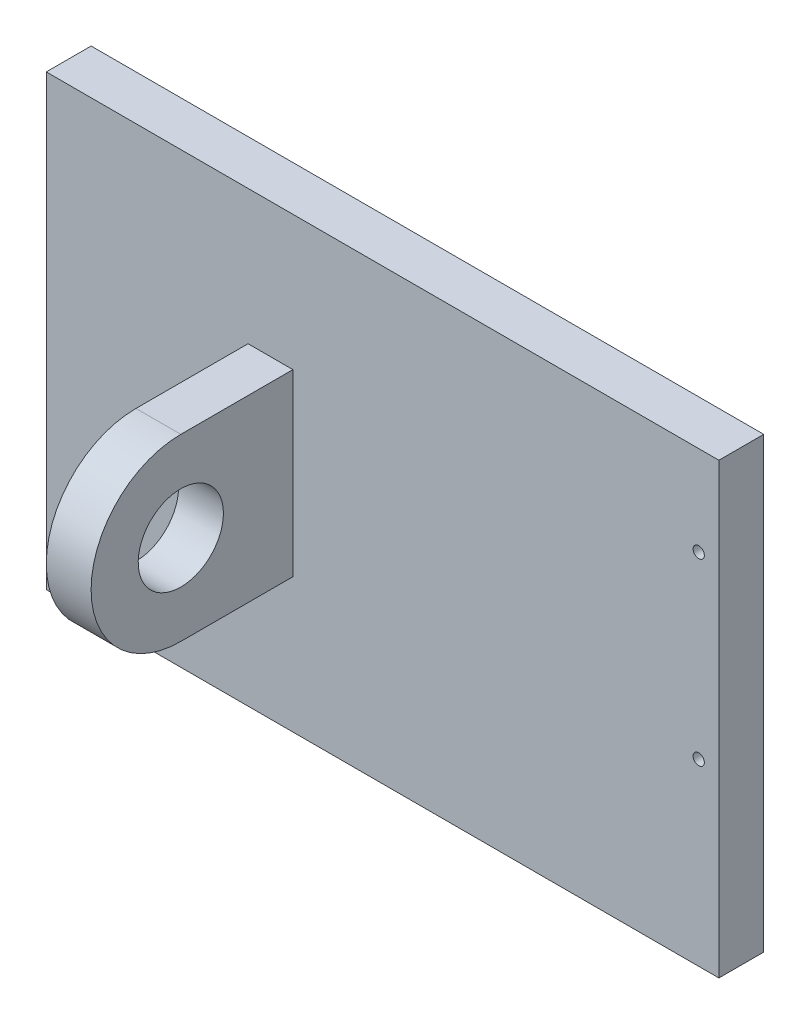
ISO-10303-21;
HEADER;
FILE_DESCRIPTION(('STEP AP214'),'2;1');
FILE_NAME('part.step','',(''),(''),'','','');
FILE_SCHEMA(('AUTOMOTIVE_DESIGN { 1 0 10303 214 1 1 1 1 }'));
ENDSEC;
DATA;
#1=APPLICATION_CONTEXT('core data for automotive mechanical design processes');
#2=APPLICATION_PROTOCOL_DEFINITION('international standard','automotive_design',2000,#1);
#3=PRODUCT_CONTEXT('',#1,'mechanical');
#4=PRODUCT('Part','Part','',(#3));
#5=PRODUCT_RELATED_PRODUCT_CATEGORY('part','',(#4));
#6=PRODUCT_DEFINITION_FORMATION('','',#4);
#7=PRODUCT_DEFINITION_CONTEXT('part definition',#1,'design');
#8=PRODUCT_DEFINITION('design','',#6,#7);
#9=PRODUCT_DEFINITION_SHAPE('','',#8);
#10=(LENGTH_UNIT() NAMED_UNIT(*) SI_UNIT(.MILLI.,.METRE.));
#11=(NAMED_UNIT(*) PLANE_ANGLE_UNIT() SI_UNIT($,.RADIAN.));
#12=(NAMED_UNIT(*) SI_UNIT($,.STERADIAN.) SOLID_ANGLE_UNIT());
#13=UNCERTAINTY_MEASURE_WITH_UNIT(LENGTH_MEASURE(1.E-05),#10,'distance_accuracy_value','');
#14=(GEOMETRIC_REPRESENTATION_CONTEXT(3) GLOBAL_UNCERTAINTY_ASSIGNED_CONTEXT((#13)) GLOBAL_UNIT_ASSIGNED_CONTEXT((#10,
#11,#12)) REPRESENTATION_CONTEXT('',''));
#15=CARTESIAN_POINT('',(0.,0.,0.));
#16=DIRECTION('',(0.,0.,1.));
#17=DIRECTION('',(1.,0.,0.));
#18=AXIS2_PLACEMENT_3D('',#15,#16,#17);
#19=CARTESIAN_POINT('',(0.,0.,10.));
#20=DIRECTION('',(0.,0.,1.));
#21=DIRECTION('',(1.,0.,0.));
#22=AXIS2_PLACEMENT_3D('',#19,#20,#21);
#23=PLANE('',#22);
#24=CARTESIAN_POINT('',(70.5,-10.00089870144,10.));
#25=DIRECTION('',(0.,0.,1.));
#26=DIRECTION('',(1.,0.,0.));
#27=AXIS2_PLACEMENT_3D('',#24,#25,#26);
#28=CIRCLE('',#27,1.24999999999999);
#29=CARTESIAN_POINT('',(71.75,-10.00089870144,10.));
#30=VERTEX_POINT('',#29);
#31=EDGE_CURVE('E242',#30,#30,#28,.T.);
#32=ORIENTED_EDGE('',*,*,#31,.F.);
#33=EDGE_LOOP('',(#32));
#34=FACE_BOUND('',#33,.T.);
#35=CARTESIAN_POINT('',(70.5,29.99910129856,10.));
#36=DIRECTION('',(0.,0.,1.));
#37=DIRECTION('',(1.,0.,0.));
#38=AXIS2_PLACEMENT_3D('',#35,#36,#37);
#39=CIRCLE('',#38,1.24999999999999);
#40=CARTESIAN_POINT('',(71.75,29.99910129856,10.));
#41=VERTEX_POINT('',#40);
#42=EDGE_CURVE('E244',#41,#41,#39,.T.);
#43=ORIENTED_EDGE('',*,*,#42,.F.);
#44=EDGE_LOOP('',(#43));
#45=FACE_BOUND('',#44,.T.);
#46=DIRECTION('',(0.,1.,0.));
#47=VECTOR('',#46,1.);
#48=CARTESIAN_POINT('',(75.,50.,10.));
#49=LINE('',#48,#47);
#50=CARTESIAN_POINT('',(75.,-50.,10.));
#51=VERTEX_POINT('',#50);
#52=CARTESIAN_POINT('',(75.,50.,10.));
#53=VERTEX_POINT('',#52);
#54=EDGE_CURVE('E161',#51,#53,#49,.T.);
#55=ORIENTED_EDGE('',*,*,#54,.T.);
#56=DIRECTION('',(-1.,0.,0.));
#57=VECTOR('',#56,1.);
#58=CARTESIAN_POINT('',(-75.,50.,10.));
#59=LINE('',#58,#57);
#60=CARTESIAN_POINT('',(-75.,50.,10.));
#61=VERTEX_POINT('',#60);
#62=EDGE_CURVE('E92',#53,#61,#59,.T.);
#63=ORIENTED_EDGE('',*,*,#62,.T.);
#64=DIRECTION('',(0.,-1.,0.));
#65=VECTOR('',#64,1.);
#66=CARTESIAN_POINT('',(-75.,50.,10.));
#67=LINE('',#66,#65);
#68=CARTESIAN_POINT('',(-75.,-50.,10.));
#69=VERTEX_POINT('',#68);
#70=EDGE_CURVE('E164',#61,#69,#67,.T.);
#71=ORIENTED_EDGE('',*,*,#70,.T.);
#72=DIRECTION('',(1.,0.,0.));
#73=VECTOR('',#72,1.);
#74=CARTESIAN_POINT('',(-75.,-50.,10.));
#75=LINE('',#74,#73);
#76=EDGE_CURVE('E64',#69,#51,#75,.T.);
#77=ORIENTED_EDGE('',*,*,#76,.T.);
#78=EDGE_LOOP('',(#55,#63,#71,#77));
#79=FACE_BOUND('',#78,.T.);
#80=DIRECTION('',(0.,1.,0.));
#81=VECTOR('',#80,1.);
#82=CARTESIAN_POINT('',(-30.,0.,10.));
#83=LINE('',#82,#81);
#84=CARTESIAN_POINT('',(-30.,-20.,10.));
#85=VERTEX_POINT('',#84);
#86=CARTESIAN_POINT('',(-30.,20.,10.));
#87=VERTEX_POINT('',#86);
#88=EDGE_CURVE('E131',#85,#87,#83,.T.);
#89=ORIENTED_EDGE('',*,*,#88,.T.);
#90=DIRECTION('',(1.,0.,0.));
#91=VECTOR('',#90,1.);
#92=CARTESIAN_POINT('',(0.,20.,10.));
#93=LINE('',#92,#91);
#94=CARTESIAN_POINT('',(-20.,20.,10.));
#95=VERTEX_POINT('',#94);
#96=EDGE_CURVE('E157',#87,#95,#93,.T.);
#97=ORIENTED_EDGE('',*,*,#96,.T.);
#98=DIRECTION('',(0.,-1.,0.));
#99=VECTOR('',#98,1.);
#100=CARTESIAN_POINT('',(-20.,0.,10.));
#101=LINE('',#100,#99);
#102=CARTESIAN_POINT('',(-20.,-20.,10.));
#103=VERTEX_POINT('',#102);
#104=EDGE_CURVE('E151',#95,#103,#101,.T.);
#105=ORIENTED_EDGE('',*,*,#104,.T.);
#106=DIRECTION('',(-1.,0.,0.));
#107=VECTOR('',#106,1.);
#108=CARTESIAN_POINT('',(0.,-20.,10.));
#109=LINE('',#108,#107);
#110=EDGE_CURVE('E154',#103,#85,#109,.T.);
#111=ORIENTED_EDGE('',*,*,#110,.T.);
#112=EDGE_LOOP('',(#89,#97,#105,#111));
#113=FACE_BOUND('',#112,.T.);
#114=ADVANCED_FACE('F40',(#34,#45,#79,#113),#23,.T.);
#115=CARTESIAN_POINT('',(75.,50.,10.));
#116=DIRECTION('',(-1.,0.,0.));
#117=DIRECTION('',(0.,-1.,0.));
#118=AXIS2_PLACEMENT_3D('',#115,#116,#117);
#119=PLANE('',#118);
#120=DIRECTION('',(0.,1.,0.));
#121=VECTOR('',#120,1.);
#122=CARTESIAN_POINT('',(75.,50.,0.));
#123=LINE('',#122,#121);
#124=CARTESIAN_POINT('',(75.,-50.,0.));
#125=VERTEX_POINT('',#124);
#126=CARTESIAN_POINT('',(75.,50.,0.));
#127=VERTEX_POINT('',#126);
#128=EDGE_CURVE('E160',#125,#127,#123,.T.);
#129=ORIENTED_EDGE('',*,*,#128,.T.);
#130=DIRECTION('',(0.,0.,-1.));
#131=VECTOR('',#130,1.);
#132=CARTESIAN_POINT('',(75.,50.,10.));
#133=LINE('',#132,#131);
#134=EDGE_CURVE('E11',#53,#127,#133,.T.);
#135=ORIENTED_EDGE('',*,*,#134,.F.);
#136=ORIENTED_EDGE('',*,*,#54,.F.);
#137=DIRECTION('',(0.,0.,-1.));
#138=VECTOR('',#137,1.);
#139=CARTESIAN_POINT('',(75.,-50.,10.));
#140=LINE('',#139,#138);
#141=EDGE_CURVE('E167',#51,#125,#140,.T.);
#142=ORIENTED_EDGE('',*,*,#141,.T.);
#143=EDGE_LOOP('',(#129,#135,#136,#142));
#144=FACE_BOUND('',#143,.T.);
#145=ADVANCED_FACE('F42',(#144),#119,.F.);
#146=CARTESIAN_POINT('',(-75.,50.,10.));
#147=DIRECTION('',(0.,-1.,0.));
#148=DIRECTION('',(0.,0.,-1.));
#149=AXIS2_PLACEMENT_3D('',#146,#147,#148);
#150=PLANE('',#149);
#151=DIRECTION('',(-1.,0.,0.));
#152=VECTOR('',#151,1.);
#153=CARTESIAN_POINT('',(-75.,50.,0.));
#154=LINE('',#153,#152);
#155=CARTESIAN_POINT('',(-75.,50.,0.));
#156=VERTEX_POINT('',#155);
#157=EDGE_CURVE('E170',#127,#156,#154,.T.);
#158=ORIENTED_EDGE('',*,*,#157,.T.);
#159=DIRECTION('',(0.,0.,-1.));
#160=VECTOR('',#159,1.);
#161=CARTESIAN_POINT('',(-75.,50.,10.));
#162=LINE('',#161,#160);
#163=EDGE_CURVE('E48',#61,#156,#162,.T.);
#164=ORIENTED_EDGE('',*,*,#163,.F.);
#165=ORIENTED_EDGE('',*,*,#62,.F.);
#166=ORIENTED_EDGE('',*,*,#134,.T.);
#167=EDGE_LOOP('',(#158,#164,#165,#166));
#168=FACE_BOUND('',#167,.T.);
#169=ADVANCED_FACE('F199',(#168),#150,.F.);
#170=CARTESIAN_POINT('',(-75.,50.,10.));
#171=DIRECTION('',(1.,0.,0.));
#172=DIRECTION('',(0.,1.,0.));
#173=AXIS2_PLACEMENT_3D('',#170,#171,#172);
#174=PLANE('',#173);
#175=DIRECTION('',(0.,-1.,0.));
#176=VECTOR('',#175,1.);
#177=CARTESIAN_POINT('',(-75.,50.,0.));
#178=LINE('',#177,#176);
#179=CARTESIAN_POINT('',(-75.,-50.,0.));
#180=VERTEX_POINT('',#179);
#181=EDGE_CURVE('E172',#156,#180,#178,.T.);
#182=ORIENTED_EDGE('',*,*,#181,.T.);
#183=DIRECTION('',(0.,0.,-1.));
#184=VECTOR('',#183,1.);
#185=CARTESIAN_POINT('',(-75.,-50.,10.));
#186=LINE('',#185,#184);
#187=EDGE_CURVE('E176',#69,#180,#186,.T.);
#188=ORIENTED_EDGE('',*,*,#187,.F.);
#189=ORIENTED_EDGE('',*,*,#70,.F.);
#190=ORIENTED_EDGE('',*,*,#163,.T.);
#191=EDGE_LOOP('',(#182,#188,#189,#190));
#192=FACE_BOUND('',#191,.T.);
#193=ADVANCED_FACE('F181',(#192),#174,.F.);
#194=CARTESIAN_POINT('',(-75.,-50.,10.));
#195=DIRECTION('',(0.,1.,0.));
#196=DIRECTION('',(0.,0.,1.));
#197=AXIS2_PLACEMENT_3D('',#194,#195,#196);
#198=PLANE('',#197);
#199=DIRECTION('',(1.,0.,0.));
#200=VECTOR('',#199,1.);
#201=CARTESIAN_POINT('',(-75.,-50.,0.));
#202=LINE('',#201,#200);
#203=EDGE_CURVE('E85',#180,#125,#202,.T.);
#204=ORIENTED_EDGE('',*,*,#203,.T.);
#205=ORIENTED_EDGE('',*,*,#141,.F.);
#206=ORIENTED_EDGE('',*,*,#76,.F.);
#207=ORIENTED_EDGE('',*,*,#187,.T.);
#208=EDGE_LOOP('',(#204,#205,#206,#207));
#209=FACE_BOUND('',#208,.T.);
#210=ADVANCED_FACE('F189',(#209),#198,.F.);
#211=CARTESIAN_POINT('',(0.,0.,0.));
#212=DIRECTION('',(0.,0.,1.));
#213=DIRECTION('',(1.,0.,0.));
#214=AXIS2_PLACEMENT_3D('',#211,#212,#213);
#215=PLANE('',#214);
#216=CARTESIAN_POINT('',(70.5,-10.00089870144,0.));
#217=DIRECTION('',(0.,0.,1.));
#218=DIRECTION('',(1.,0.,0.));
#219=AXIS2_PLACEMENT_3D('',#216,#217,#218);
#220=CIRCLE('',#219,1.24999999999999);
#221=CARTESIAN_POINT('',(71.75,-10.00089870144,0.));
#222=VERTEX_POINT('',#221);
#223=EDGE_CURVE('E240',#222,#222,#220,.T.);
#224=ORIENTED_EDGE('',*,*,#223,.T.);
#225=EDGE_LOOP('',(#224));
#226=FACE_BOUND('',#225,.T.);
#227=CARTESIAN_POINT('',(70.5,29.99910129856,0.));
#228=DIRECTION('',(0.,0.,1.));
#229=DIRECTION('',(1.,0.,0.));
#230=AXIS2_PLACEMENT_3D('',#227,#228,#229);
#231=CIRCLE('',#230,1.24999999999999);
#232=CARTESIAN_POINT('',(71.75,29.99910129856,0.));
#233=VERTEX_POINT('',#232);
#234=EDGE_CURVE('E249',#233,#233,#231,.T.);
#235=ORIENTED_EDGE('',*,*,#234,.T.);
#236=EDGE_LOOP('',(#235));
#237=FACE_BOUND('',#236,.T.);
#238=ORIENTED_EDGE('',*,*,#128,.F.);
#239=ORIENTED_EDGE('',*,*,#203,.F.);
#240=ORIENTED_EDGE('',*,*,#181,.F.);
#241=ORIENTED_EDGE('',*,*,#157,.F.);
#242=EDGE_LOOP('',(#238,#239,#240,#241));
#243=FACE_BOUND('',#242,.T.);
#244=ADVANCED_FACE('F185',(#226,#237,#243),#215,.F.);
#245=CARTESIAN_POINT('',(-20.,20.,35.));
#246=DIRECTION('',(0.,-1.,0.));
#247=DIRECTION('',(0.,0.,-1.));
#248=AXIS2_PLACEMENT_3D('',#245,#246,#247);
#249=PLANE('',#248);
#250=ORIENTED_EDGE('',*,*,#96,.F.);
#251=DIRECTION('',(0.,0.,-1.));
#252=VECTOR('',#251,1.);
#253=CARTESIAN_POINT('',(-30.,20.,35.));
#254=LINE('',#253,#252);
#255=CARTESIAN_POINT('',(-30.,20.,35.));
#256=VERTEX_POINT('',#255);
#257=EDGE_CURVE('E132',#256,#87,#254,.T.);
#258=ORIENTED_EDGE('',*,*,#257,.F.);
#259=DIRECTION('',(-1.,0.,0.));
#260=VECTOR('',#259,1.);
#261=CARTESIAN_POINT('',(-20.,20.,35.));
#262=LINE('',#261,#260);
#263=CARTESIAN_POINT('',(-20.,20.,35.));
#264=VERTEX_POINT('',#263);
#265=EDGE_CURVE('E123',#264,#256,#262,.T.);
#266=ORIENTED_EDGE('',*,*,#265,.F.);
#267=DIRECTION('',(0.,0.,-1.));
#268=VECTOR('',#267,1.);
#269=CARTESIAN_POINT('',(-20.,20.,35.));
#270=LINE('',#269,#268);
#271=EDGE_CURVE('E122',#264,#95,#270,.T.);
#272=ORIENTED_EDGE('',*,*,#271,.T.);
#273=EDGE_LOOP('',(#250,#258,#266,#272));
#274=FACE_BOUND('',#273,.T.);
#275=ADVANCED_FACE('F196',(#274),#249,.F.);
#276=CARTESIAN_POINT('',(-30.,20.,35.));
#277=DIRECTION('',(1.,0.,0.));
#278=DIRECTION('',(0.,1.,0.));
#279=AXIS2_PLACEMENT_3D('',#276,#277,#278);
#280=PLANE('',#279);
#281=CARTESIAN_POINT('',(-30.,0.,35.));
#282=DIRECTION('',(-1.,0.,0.));
#283=DIRECTION('',(0.,-1.,0.));
#284=AXIS2_PLACEMENT_3D('',#281,#282,#283);
#285=CIRCLE('',#284,9.5);
#286=CARTESIAN_POINT('',(-30.,-9.50000000000001,35.));
#287=VERTEX_POINT('',#286);
#288=EDGE_CURVE('E142',#287,#287,#285,.T.);
#289=ORIENTED_EDGE('',*,*,#288,.F.);
#290=EDGE_LOOP('',(#289));
#291=FACE_BOUND('',#290,.T.);
#292=DIRECTION('',(0.,0.,-1.));
#293=VECTOR('',#292,1.);
#294=CARTESIAN_POINT('',(-30.,-20.,35.));
#295=LINE('',#294,#293);
#296=CARTESIAN_POINT('',(-30.,-20.,35.));
#297=VERTEX_POINT('',#296);
#298=EDGE_CURVE('E117',#297,#85,#295,.T.);
#299=ORIENTED_EDGE('',*,*,#298,.F.);
#300=CARTESIAN_POINT('',(-30.,0.,35.));
#301=DIRECTION('',(-1.,0.,0.));
#302=DIRECTION('',(0.,-1.,0.));
#303=AXIS2_PLACEMENT_3D('',#300,#301,#302);
#304=CIRCLE('',#303,20.);
#305=EDGE_CURVE('E129',#297,#256,#304,.T.);
#306=ORIENTED_EDGE('',*,*,#305,.T.);
#307=ORIENTED_EDGE('',*,*,#257,.T.);
#308=ORIENTED_EDGE('',*,*,#88,.F.);
#309=EDGE_LOOP('',(#299,#306,#307,#308));
#310=FACE_BOUND('',#309,.T.);
#311=ADVANCED_FACE('F127',(#291,#310),#280,.F.);
#312=CARTESIAN_POINT('',(-30.,-20.,35.));
#313=DIRECTION('',(0.,1.,0.));
#314=DIRECTION('',(-1.,0.,0.));
#315=AXIS2_PLACEMENT_3D('',#312,#313,#314);
#316=PLANE('',#315);
#317=ORIENTED_EDGE('',*,*,#110,.F.);
#318=DIRECTION('',(0.,0.,-1.));
#319=VECTOR('',#318,1.);
#320=CARTESIAN_POINT('',(-20.,-20.,35.));
#321=LINE('',#320,#319);
#322=CARTESIAN_POINT('',(-20.,-20.,35.));
#323=VERTEX_POINT('',#322);
#324=EDGE_CURVE('E55',#323,#103,#321,.T.);
#325=ORIENTED_EDGE('',*,*,#324,.F.);
#326=DIRECTION('',(1.,0.,0.));
#327=VECTOR('',#326,1.);
#328=CARTESIAN_POINT('',(-30.,-20.,35.));
#329=LINE('',#328,#327);
#330=EDGE_CURVE('E114',#297,#323,#329,.T.);
#331=ORIENTED_EDGE('',*,*,#330,.F.);
#332=ORIENTED_EDGE('',*,*,#298,.T.);
#333=EDGE_LOOP('',(#317,#325,#331,#332));
#334=FACE_BOUND('',#333,.T.);
#335=ADVANCED_FACE('F116',(#334),#316,.F.);
#336=CARTESIAN_POINT('',(-20.,-20.,35.));
#337=DIRECTION('',(-1.,0.,0.));
#338=DIRECTION('',(0.,0.,1.));
#339=AXIS2_PLACEMENT_3D('',#336,#337,#338);
#340=PLANE('',#339);
#341=CARTESIAN_POINT('',(-20.,0.,35.));
#342=DIRECTION('',(-1.,0.,0.));
#343=DIRECTION('',(0.,-1.,0.));
#344=AXIS2_PLACEMENT_3D('',#341,#342,#343);
#345=CIRCLE('',#344,9.5);
#346=CARTESIAN_POINT('',(-20.,-9.5,35.));
#347=VERTEX_POINT('',#346);
#348=EDGE_CURVE('E138',#347,#347,#345,.T.);
#349=ORIENTED_EDGE('',*,*,#348,.T.);
#350=EDGE_LOOP('',(#349));
#351=FACE_BOUND('',#350,.T.);
#352=ORIENTED_EDGE('',*,*,#271,.F.);
#353=CARTESIAN_POINT('',(-20.,0.,35.));
#354=DIRECTION('',(-1.,0.,0.));
#355=DIRECTION('',(0.,-1.,0.));
#356=AXIS2_PLACEMENT_3D('',#353,#354,#355);
#357=CIRCLE('',#356,20.);
#358=EDGE_CURVE('E137',#323,#264,#357,.T.);
#359=ORIENTED_EDGE('',*,*,#358,.F.);
#360=ORIENTED_EDGE('',*,*,#324,.T.);
#361=ORIENTED_EDGE('',*,*,#104,.F.);
#362=EDGE_LOOP('',(#352,#359,#360,#361));
#363=FACE_BOUND('',#362,.T.);
#364=ADVANCED_FACE('F218',(#351,#363),#340,.F.);
#365=CARTESIAN_POINT('',(-20.,0.,35.));
#366=DIRECTION('',(-1.,0.,0.));
#367=DIRECTION('',(0.,-1.,0.));
#368=AXIS2_PLACEMENT_3D('',#365,#366,#367);
#369=CYLINDRICAL_SURFACE('',#368,20.);
#370=ORIENTED_EDGE('',*,*,#358,.T.);
#371=ORIENTED_EDGE('',*,*,#265,.T.);
#372=ORIENTED_EDGE('',*,*,#305,.F.);
#373=ORIENTED_EDGE('',*,*,#330,.T.);
#374=EDGE_LOOP('',(#370,#371,#372,#373));
#375=FACE_BOUND('',#374,.T.);
#376=ADVANCED_FACE('F135',(#375),#369,.T.);
#377=CARTESIAN_POINT('',(-20.,0.,35.));
#378=DIRECTION('',(-1.,0.,0.));
#379=DIRECTION('',(0.,-1.,0.));
#380=AXIS2_PLACEMENT_3D('',#377,#378,#379);
#381=CYLINDRICAL_SURFACE('',#380,9.5);
#382=ORIENTED_EDGE('',*,*,#348,.F.);
#383=EDGE_LOOP('',(#382));
#384=FACE_BOUND('',#383,.T.);
#385=ORIENTED_EDGE('',*,*,#288,.T.);
#386=EDGE_LOOP('',(#385));
#387=FACE_BOUND('',#386,.T.);
#388=ADVANCED_FACE('F224',(#384,#387),#381,.F.);
#389=CARTESIAN_POINT('',(70.5,29.99910129856,10.));
#390=DIRECTION('',(0.,0.,1.));
#391=DIRECTION('',(1.,0.,0.));
#392=AXIS2_PLACEMENT_3D('',#389,#390,#391);
#393=CYLINDRICAL_SURFACE('',#392,1.24999999999999);
#394=ORIENTED_EDGE('',*,*,#234,.F.);
#395=EDGE_LOOP('',(#394));
#396=FACE_BOUND('',#395,.T.);
#397=ORIENTED_EDGE('',*,*,#42,.T.);
#398=EDGE_LOOP('',(#397));
#399=FACE_BOUND('',#398,.T.);
#400=ADVANCED_FACE('F227',(#396,#399),#393,.F.);
#401=CARTESIAN_POINT('',(70.5,-10.00089870144,10.));
#402=DIRECTION('',(0.,0.,1.));
#403=DIRECTION('',(1.,0.,0.));
#404=AXIS2_PLACEMENT_3D('',#401,#402,#403);
#405=CYLINDRICAL_SURFACE('',#404,1.24999999999999);
#406=ORIENTED_EDGE('',*,*,#223,.F.);
#407=EDGE_LOOP('',(#406));
#408=FACE_BOUND('',#407,.T.);
#409=ORIENTED_EDGE('',*,*,#31,.T.);
#410=EDGE_LOOP('',(#409));
#411=FACE_BOUND('',#410,.T.);
#412=ADVANCED_FACE('F231',(#408,#411),#405,.F.);
#413=CLOSED_SHELL('',(#114,#145,#169,#193,#210,#244,#275,#311,#335,#364,#376,#388,#400,#412));
#414=MANIFOLD_SOLID_BREP('B2',#413);
#415=ADVANCED_BREP_SHAPE_REPRESENTATION('',(#18,#414),#14);
#416=SHAPE_DEFINITION_REPRESENTATION(#9,#415);
ENDSEC;
END-ISO-10303-21;
